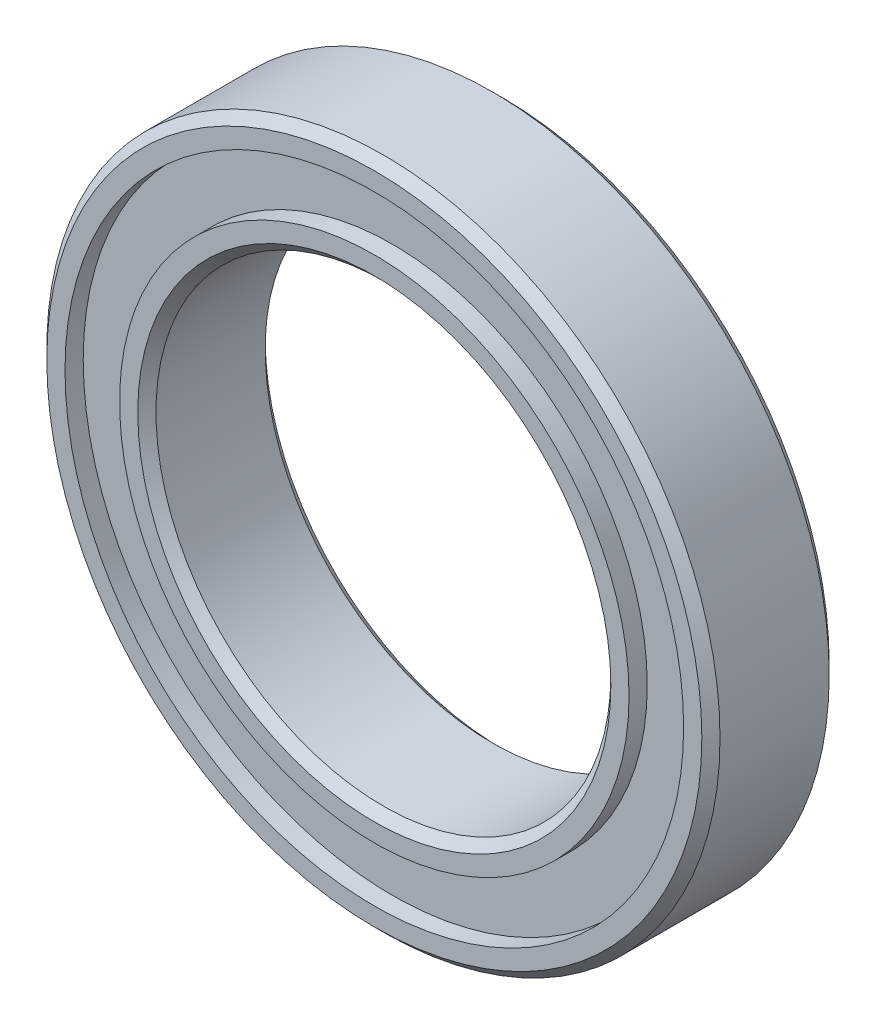
ISO-10303-21;
HEADER;
FILE_DESCRIPTION(('STEP AP214'),'2;1');
FILE_NAME('part.step','',(''),(''),'','','');
FILE_SCHEMA(('AUTOMOTIVE_DESIGN { 1 0 10303 214 1 1 1 1 }'));
ENDSEC;
DATA;
#1=APPLICATION_CONTEXT('core data for automotive mechanical design processes');
#2=APPLICATION_PROTOCOL_DEFINITION('international standard','automotive_design',2000,#1);
#3=PRODUCT_CONTEXT('',#1,'mechanical');
#4=PRODUCT('Part','Part','',(#3));
#5=PRODUCT_RELATED_PRODUCT_CATEGORY('part','',(#4));
#6=PRODUCT_DEFINITION_FORMATION('','',#4);
#7=PRODUCT_DEFINITION_CONTEXT('part definition',#1,'design');
#8=PRODUCT_DEFINITION('design','',#6,#7);
#9=PRODUCT_DEFINITION_SHAPE('','',#8);
#10=(LENGTH_UNIT() NAMED_UNIT(*) SI_UNIT(.MILLI.,.METRE.));
#11=(NAMED_UNIT(*) PLANE_ANGLE_UNIT() SI_UNIT($,.RADIAN.));
#12=(NAMED_UNIT(*) SI_UNIT($,.STERADIAN.) SOLID_ANGLE_UNIT());
#13=UNCERTAINTY_MEASURE_WITH_UNIT(LENGTH_MEASURE(1.E-05),#10,'distance_accuracy_value','');
#14=(GEOMETRIC_REPRESENTATION_CONTEXT(3) GLOBAL_UNCERTAINTY_ASSIGNED_CONTEXT((#13)) GLOBAL_UNIT_ASSIGNED_CONTEXT((#10,
#11,#12)) REPRESENTATION_CONTEXT('',''));
#15=CARTESIAN_POINT('',(0.,0.,0.));
#16=DIRECTION('',(0.,0.,1.));
#17=DIRECTION('',(1.,0.,0.));
#18=AXIS2_PLACEMENT_3D('',#15,#16,#17);
#19=CARTESIAN_POINT('',(0.,0.,-3.5));
#20=DIRECTION('',(0.,0.,1.));
#21=DIRECTION('',(1.,0.,0.));
#22=AXIS2_PLACEMENT_3D('',#19,#20,#21);
#23=PLANE('',#22);
#24=CARTESIAN_POINT('',(0.,0.,-3.5));
#25=DIRECTION('',(0.,0.,1.));
#26=DIRECTION('',(1.,0.,0.));
#27=AXIS2_PLACEMENT_3D('',#24,#25,#26);
#28=CIRCLE('',#27,13.);
#29=CARTESIAN_POINT('',(13.,0.,-3.5));
#30=VERTEX_POINT('',#29);
#31=EDGE_CURVE('E66',#30,#30,#28,.T.);
#32=ORIENTED_EDGE('',*,*,#31,.T.);
#33=EDGE_LOOP('',(#32));
#34=FACE_BOUND('',#33,.T.);
#35=CARTESIAN_POINT('',(0.,0.,-3.5));
#36=DIRECTION('',(0.,0.,1.));
#37=DIRECTION('',(1.,0.,0.));
#38=AXIS2_PLACEMENT_3D('',#35,#36,#37);
#39=CIRCLE('',#38,14.);
#40=CARTESIAN_POINT('',(14.,0.,-3.5));
#41=VERTEX_POINT('',#40);
#42=EDGE_CURVE('E97',#41,#41,#39,.T.);
#43=ORIENTED_EDGE('',*,*,#42,.F.);
#44=EDGE_LOOP('',(#43));
#45=FACE_BOUND('',#44,.T.);
#46=ADVANCED_FACE('F45',(#34,#45),#23,.F.);
#47=CARTESIAN_POINT('',(0.,0.,3.5));
#48=DIRECTION('',(0.,0.,1.));
#49=DIRECTION('',(1.,0.,0.));
#50=AXIS2_PLACEMENT_3D('',#47,#48,#49);
#51=PLANE('',#50);
#52=CARTESIAN_POINT('',(0.,0.,3.5));
#53=DIRECTION('',(0.,0.,1.));
#54=DIRECTION('',(1.,0.,0.));
#55=AXIS2_PLACEMENT_3D('',#52,#53,#54);
#56=CIRCLE('',#55,13.);
#57=CARTESIAN_POINT('',(13.,0.,3.5));
#58=VERTEX_POINT('',#57);
#59=EDGE_CURVE('E69',#58,#58,#56,.F.);
#60=ORIENTED_EDGE('',*,*,#59,.T.);
#61=EDGE_LOOP('',(#60));
#62=FACE_BOUND('',#61,.T.);
#63=CARTESIAN_POINT('',(0.,0.,3.5));
#64=DIRECTION('',(0.,0.,1.));
#65=DIRECTION('',(1.,0.,0.));
#66=AXIS2_PLACEMENT_3D('',#63,#64,#65);
#67=CIRCLE('',#66,14.);
#68=CARTESIAN_POINT('',(14.,0.,3.5));
#69=VERTEX_POINT('',#68);
#70=EDGE_CURVE('E85',#69,#69,#67,.T.);
#71=ORIENTED_EDGE('',*,*,#70,.T.);
#72=EDGE_LOOP('',(#71));
#73=FACE_BOUND('',#72,.T.);
#74=ADVANCED_FACE('F114',(#62,#73),#51,.T.);
#75=CARTESIAN_POINT('',(0.,0.,-3.5));
#76=DIRECTION('',(0.,0.,1.));
#77=DIRECTION('',(1.,0.,0.));
#78=AXIS2_PLACEMENT_3D('',#75,#76,#77);
#79=CYLINDRICAL_SURFACE('',#78,18.5);
#80=CARTESIAN_POINT('',(0.,0.,2.99999999999999));
#81=DIRECTION('',(0.,0.,1.));
#82=DIRECTION('',(1.,0.,0.));
#83=AXIS2_PLACEMENT_3D('',#80,#81,#82);
#84=CIRCLE('',#83,18.5);
#85=CARTESIAN_POINT('',(18.5,0.,2.99999999999999));
#86=VERTEX_POINT('',#85);
#87=EDGE_CURVE('E53',#86,#86,#84,.F.);
#88=ORIENTED_EDGE('',*,*,#87,.T.);
#89=EDGE_LOOP('',(#88));
#90=FACE_BOUND('',#89,.T.);
#91=CARTESIAN_POINT('',(0.,0.,-2.99999999999999));
#92=DIRECTION('',(0.,0.,1.));
#93=DIRECTION('',(1.,0.,0.));
#94=AXIS2_PLACEMENT_3D('',#91,#92,#93);
#95=CIRCLE('',#94,18.5);
#96=CARTESIAN_POINT('',(18.5,0.,-2.99999999999999));
#97=VERTEX_POINT('',#96);
#98=EDGE_CURVE('E57',#97,#97,#95,.T.);
#99=ORIENTED_EDGE('',*,*,#98,.T.);
#100=EDGE_LOOP('',(#99));
#101=FACE_BOUND('',#100,.T.);
#102=ADVANCED_FACE('F121',(#90,#101),#79,.T.);
#103=CARTESIAN_POINT('',(0.,0.,-3.5));
#104=DIRECTION('',(0.,0.,1.));
#105=DIRECTION('',(1.,0.,0.));
#106=AXIS2_PLACEMENT_3D('',#103,#104,#105);
#107=CIRCLE('',#106,18.);
#108=CARTESIAN_POINT('',(18.,0.,-3.5));
#109=VERTEX_POINT('',#108);
#110=EDGE_CURVE('E10',#109,#109,#107,.F.);
#111=ORIENTED_EDGE('',*,*,#110,.T.);
#112=EDGE_LOOP('',(#111));
#113=FACE_BOUND('',#112,.T.);
#114=CARTESIAN_POINT('',(0.,0.,-3.5));
#115=DIRECTION('',(0.,0.,1.));
#116=DIRECTION('',(1.,0.,0.));
#117=AXIS2_PLACEMENT_3D('',#114,#115,#116);
#118=CIRCLE('',#117,17.);
#119=CARTESIAN_POINT('',(17.,0.,-3.5));
#120=VERTEX_POINT('',#119);
#121=EDGE_CURVE('E91',#120,#120,#118,.T.);
#122=ORIENTED_EDGE('',*,*,#121,.T.);
#123=EDGE_LOOP('',(#122));
#124=FACE_BOUND('',#123,.T.);
#125=ADVANCED_FACE('F117',(#113,#124),#23,.F.);
#126=CARTESIAN_POINT('',(0.,0.,-3.5));
#127=DIRECTION('',(0.,0.,1.));
#128=DIRECTION('',(1.,0.,0.));
#129=AXIS2_PLACEMENT_3D('',#126,#127,#128);
#130=CYLINDRICAL_SURFACE('',#129,12.5);
#131=CARTESIAN_POINT('',(0.,0.,2.99999999999997));
#132=DIRECTION('',(0.,0.,1.));
#133=DIRECTION('',(1.,0.,0.));
#134=AXIS2_PLACEMENT_3D('',#131,#132,#133);
#135=CIRCLE('',#134,12.5);
#136=CARTESIAN_POINT('',(12.5,0.,2.99999999999997));
#137=VERTEX_POINT('',#136);
#138=EDGE_CURVE('E72',#137,#137,#135,.T.);
#139=ORIENTED_EDGE('',*,*,#138,.T.);
#140=EDGE_LOOP('',(#139));
#141=FACE_BOUND('',#140,.T.);
#142=CARTESIAN_POINT('',(0.,0.,-3.));
#143=DIRECTION('',(0.,0.,1.));
#144=DIRECTION('',(1.,0.,0.));
#145=AXIS2_PLACEMENT_3D('',#142,#143,#144);
#146=CIRCLE('',#145,12.5);
#147=CARTESIAN_POINT('',(12.5,0.,-3.));
#148=VERTEX_POINT('',#147);
#149=EDGE_CURVE('E75',#148,#148,#146,.F.);
#150=ORIENTED_EDGE('',*,*,#149,.T.);
#151=EDGE_LOOP('',(#150));
#152=FACE_BOUND('',#151,.T.);
#153=ADVANCED_FACE('F128',(#141,#152),#130,.F.);
#154=CARTESIAN_POINT('',(0.,0.,3.5));
#155=DIRECTION('',(0.,0.,1.));
#156=DIRECTION('',(1.,0.,0.));
#157=AXIS2_PLACEMENT_3D('',#154,#155,#156);
#158=CIRCLE('',#157,18.);
#159=CARTESIAN_POINT('',(18.,0.,3.5));
#160=VERTEX_POINT('',#159);
#161=EDGE_CURVE('E61',#160,#160,#158,.T.);
#162=ORIENTED_EDGE('',*,*,#161,.T.);
#163=EDGE_LOOP('',(#162));
#164=FACE_BOUND('',#163,.T.);
#165=CARTESIAN_POINT('',(0.,0.,3.5));
#166=DIRECTION('',(0.,0.,1.));
#167=DIRECTION('',(1.,0.,0.));
#168=AXIS2_PLACEMENT_3D('',#165,#166,#167);
#169=CIRCLE('',#168,17.);
#170=CARTESIAN_POINT('',(17.,0.,3.5));
#171=VERTEX_POINT('',#170);
#172=EDGE_CURVE('E79',#171,#171,#169,.T.);
#173=ORIENTED_EDGE('',*,*,#172,.F.);
#174=EDGE_LOOP('',(#173));
#175=FACE_BOUND('',#174,.T.);
#176=ADVANCED_FACE('F124',(#164,#175),#51,.T.);
#177=CARTESIAN_POINT('',(0.,0.,2.5));
#178=DIRECTION('',(0.,0.,1.));
#179=DIRECTION('',(1.,0.,0.));
#180=AXIS2_PLACEMENT_3D('',#177,#178,#179);
#181=CYLINDRICAL_SURFACE('',#180,17.);
#182=CARTESIAN_POINT('',(0.,0.,2.5));
#183=DIRECTION('',(0.,0.,1.));
#184=DIRECTION('',(1.,0.,0.));
#185=AXIS2_PLACEMENT_3D('',#182,#183,#184);
#186=CIRCLE('',#185,17.);
#187=CARTESIAN_POINT('',(17.,0.,2.5));
#188=VERTEX_POINT('',#187);
#189=EDGE_CURVE('E78',#188,#188,#186,.T.);
#190=ORIENTED_EDGE('',*,*,#189,.F.);
#191=EDGE_LOOP('',(#190));
#192=FACE_BOUND('',#191,.T.);
#193=ORIENTED_EDGE('',*,*,#172,.T.);
#194=EDGE_LOOP('',(#193));
#195=FACE_BOUND('',#194,.T.);
#196=ADVANCED_FACE('F154',(#192,#195),#181,.F.);
#197=CARTESIAN_POINT('',(0.,0.,2.5));
#198=DIRECTION('',(0.,0.,1.));
#199=DIRECTION('',(1.,0.,0.));
#200=AXIS2_PLACEMENT_3D('',#197,#198,#199);
#201=PLANE('',#200);
#202=CARTESIAN_POINT('',(0.,0.,2.5));
#203=DIRECTION('',(0.,0.,1.));
#204=DIRECTION('',(1.,0.,0.));
#205=AXIS2_PLACEMENT_3D('',#202,#203,#204);
#206=CIRCLE('',#205,14.);
#207=CARTESIAN_POINT('',(14.,0.,2.5));
#208=VERTEX_POINT('',#207);
#209=EDGE_CURVE('E82',#208,#208,#206,.T.);
#210=ORIENTED_EDGE('',*,*,#209,.F.);
#211=EDGE_LOOP('',(#210));
#212=FACE_BOUND('',#211,.T.);
#213=ORIENTED_EDGE('',*,*,#189,.T.);
#214=EDGE_LOOP('',(#213));
#215=FACE_BOUND('',#214,.T.);
#216=ADVANCED_FACE('F150',(#212,#215),#201,.T.);
#217=CARTESIAN_POINT('',(0.,0.,2.5));
#218=DIRECTION('',(0.,0.,1.));
#219=DIRECTION('',(1.,0.,0.));
#220=AXIS2_PLACEMENT_3D('',#217,#218,#219);
#221=CYLINDRICAL_SURFACE('',#220,14.);
#222=ORIENTED_EDGE('',*,*,#209,.T.);
#223=EDGE_LOOP('',(#222));
#224=FACE_BOUND('',#223,.T.);
#225=ORIENTED_EDGE('',*,*,#70,.F.);
#226=EDGE_LOOP('',(#225));
#227=FACE_BOUND('',#226,.T.);
#228=ADVANCED_FACE('F144',(#224,#227),#221,.T.);
#229=CARTESIAN_POINT('',(0.,0.,-2.5));
#230=DIRECTION('',(0.,0.,-1.));
#231=DIRECTION('',(1.,0.,0.));
#232=AXIS2_PLACEMENT_3D('',#229,#230,#231);
#233=PLANE('',#232);
#234=CARTESIAN_POINT('',(0.,0.,-2.5));
#235=DIRECTION('',(0.,0.,1.));
#236=DIRECTION('',(1.,0.,0.));
#237=AXIS2_PLACEMENT_3D('',#234,#235,#236);
#238=CIRCLE('',#237,17.);
#239=CARTESIAN_POINT('',(17.,0.,-2.5));
#240=VERTEX_POINT('',#239);
#241=EDGE_CURVE('E88',#240,#240,#238,.T.);
#242=ORIENTED_EDGE('',*,*,#241,.F.);
#243=EDGE_LOOP('',(#242));
#244=FACE_BOUND('',#243,.T.);
#245=CARTESIAN_POINT('',(0.,0.,-2.5));
#246=DIRECTION('',(0.,0.,1.));
#247=DIRECTION('',(1.,0.,0.));
#248=AXIS2_PLACEMENT_3D('',#245,#246,#247);
#249=CIRCLE('',#248,14.);
#250=CARTESIAN_POINT('',(14.,0.,-2.5));
#251=VERTEX_POINT('',#250);
#252=EDGE_CURVE('E94',#251,#251,#249,.T.);
#253=ORIENTED_EDGE('',*,*,#252,.T.);
#254=EDGE_LOOP('',(#253));
#255=FACE_BOUND('',#254,.T.);
#256=ADVANCED_FACE('F103',(#244,#255),#233,.T.);
#257=CARTESIAN_POINT('',(0.,0.,-2.5));
#258=DIRECTION('',(0.,0.,-1.));
#259=DIRECTION('',(-1.,0.,0.));
#260=AXIS2_PLACEMENT_3D('',#257,#258,#259);
#261=CYLINDRICAL_SURFACE('',#260,17.);
#262=ORIENTED_EDGE('',*,*,#241,.T.);
#263=EDGE_LOOP('',(#262));
#264=FACE_BOUND('',#263,.T.);
#265=ORIENTED_EDGE('',*,*,#121,.F.);
#266=EDGE_LOOP('',(#265));
#267=FACE_BOUND('',#266,.T.);
#268=ADVANCED_FACE('F109',(#264,#267),#261,.F.);
#269=CARTESIAN_POINT('',(0.,0.,-2.5));
#270=DIRECTION('',(0.,0.,-1.));
#271=DIRECTION('',(-1.,0.,0.));
#272=AXIS2_PLACEMENT_3D('',#269,#270,#271);
#273=CYLINDRICAL_SURFACE('',#272,14.);
#274=ORIENTED_EDGE('',*,*,#252,.F.);
#275=EDGE_LOOP('',(#274));
#276=FACE_BOUND('',#275,.T.);
#277=ORIENTED_EDGE('',*,*,#42,.T.);
#278=EDGE_LOOP('',(#277));
#279=FACE_BOUND('',#278,.T.);
#280=ADVANCED_FACE('F105',(#276,#279),#273,.T.);
#281=CARTESIAN_POINT('',(0.,0.,2.99999999999997));
#282=DIRECTION('',(0.,0.,1.));
#283=DIRECTION('',(1.,0.,0.));
#284=AXIS2_PLACEMENT_3D('',#281,#282,#283);
#285=CONICAL_SURFACE('',#284,12.5,0.785398163397447);
#286=ORIENTED_EDGE('',*,*,#59,.F.);
#287=EDGE_LOOP('',(#286));
#288=FACE_BOUND('',#287,.T.);
#289=ORIENTED_EDGE('',*,*,#138,.F.);
#290=EDGE_LOOP('',(#289));
#291=FACE_BOUND('',#290,.T.);
#292=ADVANCED_FACE('F108',(#288,#291),#285,.F.);
#293=CARTESIAN_POINT('',(0.,0.,-3.5));
#294=DIRECTION('',(0.,0.,-1.));
#295=DIRECTION('',(-1.,0.,0.));
#296=AXIS2_PLACEMENT_3D('',#293,#294,#295);
#297=CONICAL_SURFACE('',#296,13.,0.785398163397447);
#298=ORIENTED_EDGE('',*,*,#149,.F.);
#299=EDGE_LOOP('',(#298));
#300=FACE_BOUND('',#299,.T.);
#301=ORIENTED_EDGE('',*,*,#31,.F.);
#302=EDGE_LOOP('',(#301));
#303=FACE_BOUND('',#302,.T.);
#304=ADVANCED_FACE('F170',(#300,#303),#297,.F.);
#305=CARTESIAN_POINT('',(0.,0.,3.5));
#306=DIRECTION('',(0.,0.,-1.));
#307=DIRECTION('',(-1.,0.,0.));
#308=AXIS2_PLACEMENT_3D('',#305,#306,#307);
#309=CONICAL_SURFACE('',#308,18.,0.785398163397445);
#310=ORIENTED_EDGE('',*,*,#87,.F.);
#311=EDGE_LOOP('',(#310));
#312=FACE_BOUND('',#311,.T.);
#313=ORIENTED_EDGE('',*,*,#161,.F.);
#314=EDGE_LOOP('',(#313));
#315=FACE_BOUND('',#314,.T.);
#316=ADVANCED_FACE('F168',(#312,#315),#309,.T.);
#317=CARTESIAN_POINT('',(0.,0.,-2.99999999999999));
#318=DIRECTION('',(0.,0.,1.));
#319=DIRECTION('',(1.,0.,0.));
#320=AXIS2_PLACEMENT_3D('',#317,#318,#319);
#321=CONICAL_SURFACE('',#320,18.5,0.785398163397448);
#322=ORIENTED_EDGE('',*,*,#110,.F.);
#323=EDGE_LOOP('',(#322));
#324=FACE_BOUND('',#323,.T.);
#325=ORIENTED_EDGE('',*,*,#98,.F.);
#326=EDGE_LOOP('',(#325));
#327=FACE_BOUND('',#326,.T.);
#328=ADVANCED_FACE('F48',(#324,#327),#321,.T.);
#329=CLOSED_SHELL('',(#46,#74,#102,#125,#153,#176,#196,#216,#228,#256,#268,#280,#292,#304,#316,#328));
#330=MANIFOLD_SOLID_BREP('B2',#329);
#331=ADVANCED_BREP_SHAPE_REPRESENTATION('',(#18,#330),#14);
#332=SHAPE_DEFINITION_REPRESENTATION(#9,#331);
ENDSEC;
END-ISO-10303-21;
